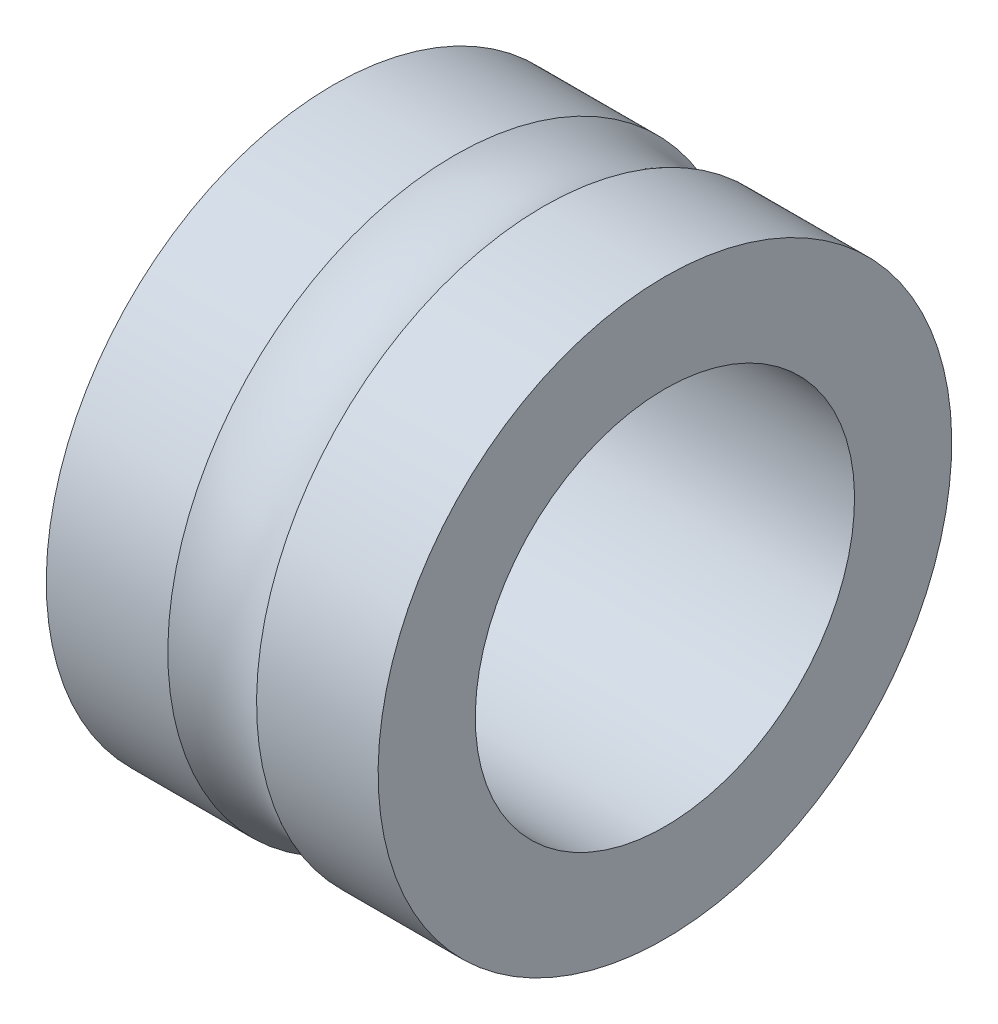
ISO-10303-21;
HEADER;
FILE_DESCRIPTION(('STEP AP214'),'2;1');
FILE_NAME('part.step','',(''),(''),'','','');
FILE_SCHEMA(('AUTOMOTIVE_DESIGN { 1 0 10303 214 1 1 1 1 }'));
ENDSEC;
DATA;
#1=APPLICATION_CONTEXT('core data for automotive mechanical design processes');
#2=APPLICATION_PROTOCOL_DEFINITION('international standard','automotive_design',2000,#1);
#3=PRODUCT_CONTEXT('',#1,'mechanical');
#4=PRODUCT('Part','Part','',(#3));
#5=PRODUCT_RELATED_PRODUCT_CATEGORY('part','',(#4));
#6=PRODUCT_DEFINITION_FORMATION('','',#4);
#7=PRODUCT_DEFINITION_CONTEXT('part definition',#1,'design');
#8=PRODUCT_DEFINITION('design','',#6,#7);
#9=PRODUCT_DEFINITION_SHAPE('','',#8);
#10=(LENGTH_UNIT() NAMED_UNIT(*) SI_UNIT(.MILLI.,.METRE.));
#11=(NAMED_UNIT(*) PLANE_ANGLE_UNIT() SI_UNIT($,.RADIAN.));
#12=(NAMED_UNIT(*) SI_UNIT($,.STERADIAN.) SOLID_ANGLE_UNIT());
#13=UNCERTAINTY_MEASURE_WITH_UNIT(LENGTH_MEASURE(1.E-05),#10,'distance_accuracy_value','');
#14=(GEOMETRIC_REPRESENTATION_CONTEXT(3) GLOBAL_UNCERTAINTY_ASSIGNED_CONTEXT((#13)) GLOBAL_UNIT_ASSIGNED_CONTEXT((#10,
#11,#12)) REPRESENTATION_CONTEXT('',''));
#15=CARTESIAN_POINT('',(0.,0.,0.));
#16=DIRECTION('',(0.,0.,1.));
#17=DIRECTION('',(1.,0.,0.));
#18=AXIS2_PLACEMENT_3D('',#15,#16,#17);
#19=CARTESIAN_POINT('',(0.,0.,0.));
#20=DIRECTION('',(1.,0.,0.));
#21=DIRECTION('',(0.,1.,0.));
#22=AXIS2_PLACEMENT_3D('',#19,#20,#21);
#23=TOROIDAL_SURFACE('',#22,7.8,1.9845);
#24=CARTESIAN_POINT('',(0.93580994331114,0.,0.));
#25=DIRECTION('',(1.,0.,0.));
#26=DIRECTION('',(0.,1.,0.));
#27=AXIS2_PLACEMENT_3D('',#24,#25,#26);
#28=CIRCLE('',#27,6.05);
#29=CARTESIAN_POINT('',(0.93580994331114,6.05,0.));
#30=VERTEX_POINT('',#29);
#31=EDGE_CURVE('E62',#30,#30,#28,.T.);
#32=ORIENTED_EDGE('',*,*,#31,.F.);
#33=EDGE_LOOP('',(#32));
#34=FACE_BOUND('',#33,.T.);
#35=CARTESIAN_POINT('',(-0.93580994331114,0.,0.));
#36=DIRECTION('',(1.,0.,0.));
#37=DIRECTION('',(0.,1.,0.));
#38=AXIS2_PLACEMENT_3D('',#35,#36,#37);
#39=CIRCLE('',#38,6.05);
#40=CARTESIAN_POINT('',(-0.935809943311141,6.05,0.));
#41=VERTEX_POINT('',#40);
#42=EDGE_CURVE('E10',#41,#41,#39,.T.);
#43=ORIENTED_EDGE('',*,*,#42,.T.);
#44=EDGE_LOOP('',(#43));
#45=FACE_BOUND('',#44,.T.);
#46=ADVANCED_FACE('F39',(#34,#45),#23,.F.);
#47=CARTESIAN_POINT('',(23.6601859567376,0.,0.));
#48=DIRECTION('',(1.,0.,0.));
#49=DIRECTION('',(0.,1.,0.));
#50=AXIS2_PLACEMENT_3D('',#47,#48,#49);
#51=CYLINDRICAL_SURFACE('',#50,6.05);
#52=ORIENTED_EDGE('',*,*,#42,.F.);
#53=EDGE_LOOP('',(#52));
#54=FACE_BOUND('',#53,.T.);
#55=CARTESIAN_POINT('',(-3.5,0.,0.));
#56=DIRECTION('',(1.,0.,0.));
#57=DIRECTION('',(0.,1.,0.));
#58=AXIS2_PLACEMENT_3D('',#55,#56,#57);
#59=CIRCLE('',#58,6.05);
#60=CARTESIAN_POINT('',(-3.5,6.05,0.));
#61=VERTEX_POINT('',#60);
#62=EDGE_CURVE('E45',#61,#61,#59,.T.);
#63=ORIENTED_EDGE('',*,*,#62,.T.);
#64=EDGE_LOOP('',(#63));
#65=FACE_BOUND('',#64,.T.);
#66=ADVANCED_FACE('F69',(#54,#65),#51,.T.);
#67=CARTESIAN_POINT('',(-3.5,0.,0.));
#68=DIRECTION('',(1.,0.,0.));
#69=DIRECTION('',(0.,1.,0.));
#70=AXIS2_PLACEMENT_3D('',#67,#68,#69);
#71=PLANE('',#70);
#72=ORIENTED_EDGE('',*,*,#62,.F.);
#73=EDGE_LOOP('',(#72));
#74=FACE_BOUND('',#73,.T.);
#75=CARTESIAN_POINT('',(-3.5,0.,0.));
#76=DIRECTION('',(1.,0.,0.));
#77=DIRECTION('',(0.,1.,0.));
#78=AXIS2_PLACEMENT_3D('',#75,#76,#77);
#79=CIRCLE('',#78,4.);
#80=CARTESIAN_POINT('',(-3.5,4.,0.));
#81=VERTEX_POINT('',#80);
#82=EDGE_CURVE('E49',#81,#81,#79,.T.);
#83=ORIENTED_EDGE('',*,*,#82,.T.);
#84=EDGE_LOOP('',(#83));
#85=FACE_BOUND('',#84,.T.);
#86=ADVANCED_FACE('F73',(#74,#85),#71,.F.);
#87=CARTESIAN_POINT('',(23.6601859567376,0.,0.));
#88=DIRECTION('',(1.,0.,0.));
#89=DIRECTION('',(0.,1.,0.));
#90=AXIS2_PLACEMENT_3D('',#87,#88,#89);
#91=CYLINDRICAL_SURFACE('',#90,4.);
#92=ORIENTED_EDGE('',*,*,#82,.F.);
#93=EDGE_LOOP('',(#92));
#94=FACE_BOUND('',#93,.T.);
#95=CARTESIAN_POINT('',(3.5,0.,0.));
#96=DIRECTION('',(1.,0.,0.));
#97=DIRECTION('',(0.,1.,0.));
#98=AXIS2_PLACEMENT_3D('',#95,#96,#97);
#99=CIRCLE('',#98,4.);
#100=CARTESIAN_POINT('',(3.5,4.,0.));
#101=VERTEX_POINT('',#100);
#102=EDGE_CURVE('E53',#101,#101,#99,.T.);
#103=ORIENTED_EDGE('',*,*,#102,.T.);
#104=EDGE_LOOP('',(#103));
#105=FACE_BOUND('',#104,.T.);
#106=ADVANCED_FACE('F79',(#94,#105),#91,.F.);
#107=CARTESIAN_POINT('',(3.5,0.,0.));
#108=DIRECTION('',(-1.,0.,0.));
#109=DIRECTION('',(0.,-1.,0.));
#110=AXIS2_PLACEMENT_3D('',#107,#108,#109);
#111=PLANE('',#110);
#112=ORIENTED_EDGE('',*,*,#102,.F.);
#113=EDGE_LOOP('',(#112));
#114=FACE_BOUND('',#113,.T.);
#115=CARTESIAN_POINT('',(3.5,0.,0.));
#116=DIRECTION('',(1.,0.,0.));
#117=DIRECTION('',(0.,1.,0.));
#118=AXIS2_PLACEMENT_3D('',#115,#116,#117);
#119=CIRCLE('',#118,6.05);
#120=CARTESIAN_POINT('',(3.5,6.05,0.));
#121=VERTEX_POINT('',#120);
#122=EDGE_CURVE('E59',#121,#121,#119,.T.);
#123=ORIENTED_EDGE('',*,*,#122,.T.);
#124=EDGE_LOOP('',(#123));
#125=FACE_BOUND('',#124,.T.);
#126=ADVANCED_FACE('F83',(#114,#125),#111,.F.);
#127=ORIENTED_EDGE('',*,*,#122,.F.);
#128=EDGE_LOOP('',(#127));
#129=FACE_BOUND('',#128,.T.);
#130=ORIENTED_EDGE('',*,*,#31,.T.);
#131=EDGE_LOOP('',(#130));
#132=FACE_BOUND('',#131,.T.);
#133=ADVANCED_FACE('F66',(#129,#132),#51,.T.);
#134=CLOSED_SHELL('',(#46,#66,#86,#106,#126,#133));
#135=MANIFOLD_SOLID_BREP('B2',#134);
#136=ADVANCED_BREP_SHAPE_REPRESENTATION('',(#18,#135),#14);
#137=SHAPE_DEFINITION_REPRESENTATION(#9,#136);
ENDSEC;
END-ISO-10303-21;
